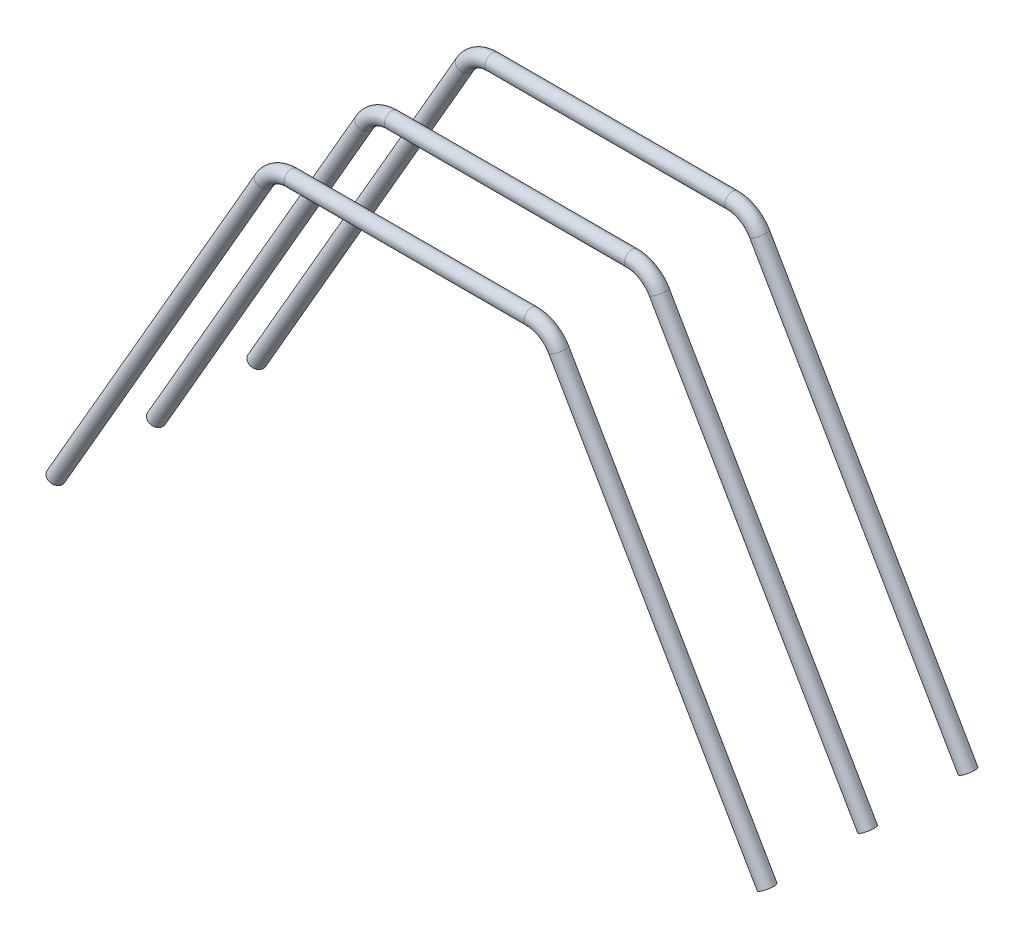
ISO-10303-21;
HEADER;
FILE_DESCRIPTION(('STEP AP214'),'2;1');
FILE_NAME('part.step','',(''),(''),'','','');
FILE_SCHEMA(('AUTOMOTIVE_DESIGN { 1 0 10303 214 1 1 1 1 }'));
ENDSEC;
DATA;
#1=APPLICATION_CONTEXT('core data for automotive mechanical design processes');
#2=APPLICATION_PROTOCOL_DEFINITION('international standard','automotive_design',2000,#1);
#3=PRODUCT_CONTEXT('',#1,'mechanical');
#4=PRODUCT('Part','Part','',(#3));
#5=PRODUCT_RELATED_PRODUCT_CATEGORY('part','',(#4));
#6=PRODUCT_DEFINITION_FORMATION('','',#4);
#7=PRODUCT_DEFINITION_CONTEXT('part definition',#1,'design');
#8=PRODUCT_DEFINITION('design','',#6,#7);
#9=PRODUCT_DEFINITION_SHAPE('','',#8);
#10=(LENGTH_UNIT() NAMED_UNIT(*) SI_UNIT(.MILLI.,.METRE.));
#11=(NAMED_UNIT(*) PLANE_ANGLE_UNIT() SI_UNIT($,.RADIAN.));
#12=(NAMED_UNIT(*) SI_UNIT($,.STERADIAN.) SOLID_ANGLE_UNIT());
#13=UNCERTAINTY_MEASURE_WITH_UNIT(LENGTH_MEASURE(1.E-05),#10,'distance_accuracy_value','');
#14=(GEOMETRIC_REPRESENTATION_CONTEXT(3) GLOBAL_UNCERTAINTY_ASSIGNED_CONTEXT((#13)) GLOBAL_UNIT_ASSIGNED_CONTEXT((#10,
#11,#12)) REPRESENTATION_CONTEXT('',''));
#15=CARTESIAN_POINT('',(0.,0.,0.));
#16=DIRECTION('',(0.,0.,1.));
#17=DIRECTION('',(1.,0.,0.));
#18=AXIS2_PLACEMENT_3D('',#15,#16,#17);
#19=CARTESIAN_POINT('',(283.205080756887,-322.,80.));
#20=DIRECTION('',(0.499999999999998,-0.86602540378444,0.));
#21=DIRECTION('',(0.,0.,1.));
#22=AXIS2_PLACEMENT_3D('',#19,#20,#21);
#23=PLANE('',#22);
#24=CARTESIAN_POINT('',(283.205080756887,-322.,80.));
#25=DIRECTION('',(-0.499999999999998,0.86602540378444,0.));
#26=DIRECTION('',(0.,0.,1.));
#27=AXIS2_PLACEMENT_3D('',#24,#25,#26);
#28=CIRCLE('',#27,6.);
#29=CARTESIAN_POINT('',(283.205080756887,-322.,86.));
#30=VERTEX_POINT('',#29);
#31=EDGE_CURVE('E11',#30,#30,#28,.T.);
#32=ORIENTED_EDGE('',*,*,#31,.F.);
#33=EDGE_LOOP('',(#32));
#34=FACE_BOUND('',#33,.T.);
#35=ADVANCED_FACE('F45',(#34),#23,.T.);
#36=CARTESIAN_POINT('',(0.,-22.,80.));
#37=DIRECTION('',(1.,0.,0.));
#38=DIRECTION('',(0.,1.,0.));
#39=AXIS2_PLACEMENT_3D('',#36,#37,#38);
#40=CYLINDRICAL_SURFACE('',#39,6.);
#41=CARTESIAN_POINT('',(95.5662432702594,-22.,80.));
#42=DIRECTION('',(-1.,0.,0.));
#43=DIRECTION('',(0.,0.,1.));
#44=AXIS2_PLACEMENT_3D('',#41,#42,#43);
#45=CIRCLE('',#44,6.);
#46=CARTESIAN_POINT('',(95.5662432702594,-16.,80.));
#47=VERTEX_POINT('',#46);
#48=EDGE_CURVE('E58',#47,#47,#45,.T.);
#49=ORIENTED_EDGE('',*,*,#48,.T.);
#50=EDGE_LOOP('',(#49));
#51=FACE_BOUND('',#50,.T.);
#52=CARTESIAN_POINT('',(-95.5662432702594,-22.,80.));
#53=DIRECTION('',(-1.,0.,0.));
#54=DIRECTION('',(0.,0.,1.));
#55=AXIS2_PLACEMENT_3D('',#52,#53,#54);
#56=CIRCLE('',#55,6.);
#57=CARTESIAN_POINT('',(-95.5662432702594,-16.,80.));
#58=VERTEX_POINT('',#57);
#59=EDGE_CURVE('E74',#58,#58,#56,.F.);
#60=ORIENTED_EDGE('',*,*,#59,.T.);
#61=EDGE_LOOP('',(#60));
#62=FACE_BOUND('',#61,.T.);
#63=ADVANCED_FACE('F80',(#51,#62),#40,.T.);
#64=CARTESIAN_POINT('',(95.5662432702594,-47.,80.));
#65=DIRECTION('',(0.,0.,1.));
#66=DIRECTION('',(-1.,0.,0.));
#67=AXIS2_PLACEMENT_3D('',#64,#65,#66);
#68=TOROIDAL_SURFACE('',#67,25.,6.);
#69=CARTESIAN_POINT('',(117.21687836487,-34.5,80.));
#70=DIRECTION('',(-0.499999999999998,0.86602540378444,0.));
#71=DIRECTION('',(0.,0.,1.));
#72=AXIS2_PLACEMENT_3D('',#69,#70,#71);
#73=CIRCLE('',#72,6.);
#74=CARTESIAN_POINT('',(122.413030787577,-31.5000000000001,80.));
#75=VERTEX_POINT('',#74);
#76=EDGE_CURVE('E52',#75,#75,#73,.T.);
#77=CARTESIAN_POINT('',(95.5662432702594,-47.,80.));
#78=DIRECTION('',(0.,0.,1.));
#79=DIRECTION('',(-1.,0.,0.));
#80=AXIS2_PLACEMENT_3D('',#77,#78,#79);
#81=CIRCLE('',#80,31.);
#82=EDGE_CURVE('',#75,#47,#81,.T.);
#83=ORIENTED_EDGE('',*,*,#76,.T.);
#84=ORIENTED_EDGE('',*,*,#48,.F.);
#85=ORIENTED_EDGE('',*,*,#82,.T.);
#86=ORIENTED_EDGE('',*,*,#82,.F.);
#87=EDGE_LOOP('',(#83,#85,#84,#86));
#88=FACE_BOUND('',#87,.T.);
#89=ADVANCED_FACE('F102',(#88),#68,.T.);
#90=CARTESIAN_POINT('',(117.21687836487,-34.5,80.));
#91=DIRECTION('',(0.499999999999998,-0.86602540378444,0.));
#92=DIRECTION('',(0.86602540378444,0.499999999999998,0.));
#93=AXIS2_PLACEMENT_3D('',#90,#91,#92);
#94=CYLINDRICAL_SURFACE('',#93,6.);
#95=ORIENTED_EDGE('',*,*,#31,.T.);
#96=EDGE_LOOP('',(#95));
#97=FACE_BOUND('',#96,.T.);
#98=ORIENTED_EDGE('',*,*,#76,.F.);
#99=EDGE_LOOP('',(#98));
#100=FACE_BOUND('',#99,.T.);
#101=ADVANCED_FACE('F94',(#97,#100),#94,.T.);
#102=CARTESIAN_POINT('',(-283.205080756887,-322.,80.));
#103=DIRECTION('',(-0.499999999999998,-0.86602540378444,0.));
#104=DIRECTION('',(0.,0.,1.));
#105=AXIS2_PLACEMENT_3D('',#102,#103,#104);
#106=PLANE('',#105);
#107=CARTESIAN_POINT('',(-283.205080756887,-322.,80.));
#108=DIRECTION('',(-0.499999999999998,-0.86602540378444,0.));
#109=DIRECTION('',(0.,0.,1.));
#110=AXIS2_PLACEMENT_3D('',#107,#108,#109);
#111=CIRCLE('',#110,6.);
#112=CARTESIAN_POINT('',(-283.205080756887,-322.,86.));
#113=VERTEX_POINT('',#112);
#114=EDGE_CURVE('E64',#113,#113,#111,.F.);
#115=ORIENTED_EDGE('',*,*,#114,.F.);
#116=EDGE_LOOP('',(#115));
#117=FACE_BOUND('',#116,.T.);
#118=ADVANCED_FACE('F85',(#117),#106,.T.);
#119=CARTESIAN_POINT('',(-95.5662432702594,-47.,80.));
#120=DIRECTION('',(0.,0.,-1.));
#121=DIRECTION('',(1.,0.,0.));
#122=AXIS2_PLACEMENT_3D('',#119,#120,#121);
#123=TOROIDAL_SURFACE('',#122,25.,6.);
#124=CARTESIAN_POINT('',(-117.21687836487,-34.5,80.));
#125=DIRECTION('',(-0.499999999999998,-0.86602540378444,0.));
#126=DIRECTION('',(0.,0.,1.));
#127=AXIS2_PLACEMENT_3D('',#124,#125,#126);
#128=CIRCLE('',#127,6.);
#129=CARTESIAN_POINT('',(-122.413030787577,-31.5000000000001,80.));
#130=VERTEX_POINT('',#129);
#131=EDGE_CURVE('E70',#130,#130,#128,.F.);
#132=CARTESIAN_POINT('',(-95.5662432702594,-47.,80.));
#133=DIRECTION('',(0.,0.,-1.));
#134=DIRECTION('',(1.,0.,0.));
#135=AXIS2_PLACEMENT_3D('',#132,#133,#134);
#136=CIRCLE('',#135,31.);
#137=EDGE_CURVE('',#130,#58,#136,.T.);
#138=ORIENTED_EDGE('',*,*,#131,.T.);
#139=ORIENTED_EDGE('',*,*,#59,.F.);
#140=ORIENTED_EDGE('',*,*,#137,.T.);
#141=ORIENTED_EDGE('',*,*,#137,.F.);
#142=EDGE_LOOP('',(#138,#140,#139,#141));
#143=FACE_BOUND('',#142,.T.);
#144=ADVANCED_FACE('F82',(#143),#123,.T.);
#145=CARTESIAN_POINT('',(-117.21687836487,-34.5,80.));
#146=DIRECTION('',(-0.499999999999998,-0.86602540378444,0.));
#147=DIRECTION('',(0.86602540378444,-0.499999999999998,0.));
#148=AXIS2_PLACEMENT_3D('',#145,#146,#147);
#149=CYLINDRICAL_SURFACE('',#148,6.);
#150=ORIENTED_EDGE('',*,*,#114,.T.);
#151=EDGE_LOOP('',(#150));
#152=FACE_BOUND('',#151,.T.);
#153=ORIENTED_EDGE('',*,*,#131,.F.);
#154=EDGE_LOOP('',(#153));
#155=FACE_BOUND('',#154,.T.);
#156=ADVANCED_FACE('F84',(#152,#155),#149,.T.);
#157=CLOSED_SHELL('',(#35,#63,#89,#101,#118,#144,#156));
#158=MANIFOLD_SOLID_BREP('B2',#157);
#159=CARTESIAN_POINT('',(283.205080756887,-322.,-80.));
#160=DIRECTION('',(0.499999999999998,-0.86602540378444,0.));
#161=DIRECTION('',(0.,0.,-1.));
#162=AXIS2_PLACEMENT_3D('',#159,#160,#161);
#163=PLANE('',#162);
#164=CARTESIAN_POINT('',(283.205080756887,-322.,-80.));
#165=DIRECTION('',(0.499999999999998,-0.86602540378444,0.));
#166=DIRECTION('',(0.,0.,-1.));
#167=AXIS2_PLACEMENT_3D('',#164,#165,#166);
#168=CIRCLE('',#167,6.);
#169=CARTESIAN_POINT('',(283.205080756887,-322.,-86.));
#170=VERTEX_POINT('',#169);
#171=EDGE_CURVE('E44',#170,#170,#168,.T.);
#172=ORIENTED_EDGE('',*,*,#171,.T.);
#173=EDGE_LOOP('',(#172));
#174=FACE_BOUND('',#173,.T.);
#175=ADVANCED_FACE('F181',(#174),#163,.T.);
#176=CARTESIAN_POINT('',(0.,-22.,-80.));
#177=DIRECTION('',(1.,0.,0.));
#178=DIRECTION('',(0.,1.,0.));
#179=AXIS2_PLACEMENT_3D('',#176,#177,#178);
#180=CYLINDRICAL_SURFACE('',#179,6.);
#181=CARTESIAN_POINT('',(95.5662432702594,-22.,-80.));
#182=DIRECTION('',(1.,0.,0.));
#183=DIRECTION('',(0.,0.,-1.));
#184=AXIS2_PLACEMENT_3D('',#181,#182,#183);
#185=CIRCLE('',#184,6.);
#186=CARTESIAN_POINT('',(95.5662432702594,-16.,-80.));
#187=VERTEX_POINT('',#186);
#188=EDGE_CURVE('E194',#187,#187,#185,.T.);
#189=ORIENTED_EDGE('',*,*,#188,.F.);
#190=EDGE_LOOP('',(#189));
#191=FACE_BOUND('',#190,.T.);
#192=CARTESIAN_POINT('',(-95.5662432702594,-22.,-80.));
#193=DIRECTION('',(1.,0.,0.));
#194=DIRECTION('',(0.,0.,-1.));
#195=AXIS2_PLACEMENT_3D('',#192,#193,#194);
#196=CIRCLE('',#195,6.);
#197=CARTESIAN_POINT('',(-95.5662432702594,-16.,-80.));
#198=VERTEX_POINT('',#197);
#199=EDGE_CURVE('E210',#198,#198,#196,.F.);
#200=ORIENTED_EDGE('',*,*,#199,.F.);
#201=EDGE_LOOP('',(#200));
#202=FACE_BOUND('',#201,.T.);
#203=ADVANCED_FACE('F218',(#191,#202),#180,.T.);
#204=CARTESIAN_POINT('',(95.5662432702594,-47.,-80.));
#205=DIRECTION('',(0.,0.,-1.));
#206=DIRECTION('',(-1.,0.,0.));
#207=AXIS2_PLACEMENT_3D('',#204,#205,#206);
#208=TOROIDAL_SURFACE('',#207,25.,6.);
#209=CARTESIAN_POINT('',(117.21687836487,-34.5,-80.));
#210=DIRECTION('',(0.499999999999998,-0.86602540378444,0.));
#211=DIRECTION('',(0.,0.,-1.));
#212=AXIS2_PLACEMENT_3D('',#209,#210,#211);
#213=CIRCLE('',#212,6.);
#214=CARTESIAN_POINT('',(122.413030787577,-31.5000000000001,-80.));
#215=VERTEX_POINT('',#214);
#216=EDGE_CURVE('E188',#215,#215,#213,.T.);
#217=CARTESIAN_POINT('',(95.5662432702594,-47.,-80.));
#218=DIRECTION('',(0.,0.,-1.));
#219=DIRECTION('',(-1.,0.,0.));
#220=AXIS2_PLACEMENT_3D('',#217,#218,#219);
#221=CIRCLE('',#220,31.);
#222=EDGE_CURVE('',#187,#215,#221,.T.);
#223=ORIENTED_EDGE('',*,*,#188,.T.);
#224=ORIENTED_EDGE('',*,*,#216,.F.);
#225=ORIENTED_EDGE('',*,*,#222,.T.);
#226=ORIENTED_EDGE('',*,*,#222,.F.);
#227=EDGE_LOOP('',(#223,#225,#224,#226));
#228=FACE_BOUND('',#227,.T.);
#229=ADVANCED_FACE('F220',(#228),#208,.T.);
#230=CARTESIAN_POINT('',(117.21687836487,-34.5,-80.));
#231=DIRECTION('',(0.499999999999998,-0.86602540378444,0.));
#232=DIRECTION('',(0.86602540378444,0.499999999999998,0.));
#233=AXIS2_PLACEMENT_3D('',#230,#231,#232);
#234=CYLINDRICAL_SURFACE('',#233,6.);
#235=ORIENTED_EDGE('',*,*,#171,.F.);
#236=EDGE_LOOP('',(#235));
#237=FACE_BOUND('',#236,.T.);
#238=ORIENTED_EDGE('',*,*,#216,.T.);
#239=EDGE_LOOP('',(#238));
#240=FACE_BOUND('',#239,.T.);
#241=ADVANCED_FACE('F227',(#237,#240),#234,.T.);
#242=CARTESIAN_POINT('',(-283.205080756887,-322.,-80.));
#243=DIRECTION('',(-0.499999999999998,-0.86602540378444,0.));
#244=DIRECTION('',(0.,0.,-1.));
#245=AXIS2_PLACEMENT_3D('',#242,#243,#244);
#246=PLANE('',#245);
#247=CARTESIAN_POINT('',(-283.205080756887,-322.,-80.));
#248=DIRECTION('',(0.499999999999998,0.86602540378444,0.));
#249=DIRECTION('',(0.,0.,-1.));
#250=AXIS2_PLACEMENT_3D('',#247,#248,#249);
#251=CIRCLE('',#250,6.);
#252=CARTESIAN_POINT('',(-283.205080756887,-322.,-86.));
#253=VERTEX_POINT('',#252);
#254=EDGE_CURVE('E200',#253,#253,#251,.F.);
#255=ORIENTED_EDGE('',*,*,#254,.T.);
#256=EDGE_LOOP('',(#255));
#257=FACE_BOUND('',#256,.T.);
#258=ADVANCED_FACE('F234',(#257),#246,.T.);
#259=CARTESIAN_POINT('',(-95.5662432702594,-47.,-80.));
#260=DIRECTION('',(0.,0.,1.));
#261=DIRECTION('',(1.,0.,0.));
#262=AXIS2_PLACEMENT_3D('',#259,#260,#261);
#263=TOROIDAL_SURFACE('',#262,25.,6.);
#264=CARTESIAN_POINT('',(-117.21687836487,-34.5,-80.));
#265=DIRECTION('',(0.499999999999998,0.86602540378444,0.));
#266=DIRECTION('',(0.,0.,-1.));
#267=AXIS2_PLACEMENT_3D('',#264,#265,#266);
#268=CIRCLE('',#267,6.);
#269=CARTESIAN_POINT('',(-122.413030787577,-31.5000000000001,-80.));
#270=VERTEX_POINT('',#269);
#271=EDGE_CURVE('E206',#270,#270,#268,.F.);
#272=CARTESIAN_POINT('',(-95.5662432702594,-47.,-80.));
#273=DIRECTION('',(0.,0.,1.));
#274=DIRECTION('',(1.,0.,0.));
#275=AXIS2_PLACEMENT_3D('',#272,#273,#274);
#276=CIRCLE('',#275,31.);
#277=EDGE_CURVE('',#198,#270,#276,.T.);
#278=ORIENTED_EDGE('',*,*,#199,.T.);
#279=ORIENTED_EDGE('',*,*,#271,.F.);
#280=ORIENTED_EDGE('',*,*,#277,.T.);
#281=ORIENTED_EDGE('',*,*,#277,.F.);
#282=EDGE_LOOP('',(#278,#280,#279,#281));
#283=FACE_BOUND('',#282,.T.);
#284=ADVANCED_FACE('F216',(#283),#263,.T.);
#285=CARTESIAN_POINT('',(-117.21687836487,-34.5,-80.));
#286=DIRECTION('',(-0.499999999999998,-0.86602540378444,0.));
#287=DIRECTION('',(0.86602540378444,-0.499999999999998,0.));
#288=AXIS2_PLACEMENT_3D('',#285,#286,#287);
#289=CYLINDRICAL_SURFACE('',#288,6.);
#290=ORIENTED_EDGE('',*,*,#254,.F.);
#291=EDGE_LOOP('',(#290));
#292=FACE_BOUND('',#291,.T.);
#293=ORIENTED_EDGE('',*,*,#271,.T.);
#294=EDGE_LOOP('',(#293));
#295=FACE_BOUND('',#294,.T.);
#296=ADVANCED_FACE('F230',(#292,#295),#289,.T.);
#297=CLOSED_SHELL('',(#175,#203,#229,#241,#258,#284,#296));
#298=MANIFOLD_SOLID_BREP('B6',#297);
#299=CARTESIAN_POINT('',(283.205080756887,-322.,0.));
#300=DIRECTION('',(0.499999999999998,-0.86602540378444,0.));
#301=DIRECTION('',(0.,0.,-1.));
#302=AXIS2_PLACEMENT_3D('',#299,#300,#301);
#303=PLANE('',#302);
#304=CARTESIAN_POINT('',(283.205080756887,-322.,0.));
#305=DIRECTION('',(0.499999999999998,-0.86602540378444,0.));
#306=DIRECTION('',(0.,0.,-1.));
#307=AXIS2_PLACEMENT_3D('',#304,#305,#306);
#308=CIRCLE('',#307,6.);
#309=CARTESIAN_POINT('',(283.205080756887,-322.,-6.));
#310=VERTEX_POINT('',#309);
#311=EDGE_CURVE('E180',#310,#310,#308,.T.);
#312=ORIENTED_EDGE('',*,*,#311,.T.);
#313=EDGE_LOOP('',(#312));
#314=FACE_BOUND('',#313,.T.);
#315=ADVANCED_FACE('F310',(#314),#303,.T.);
#316=CARTESIAN_POINT('',(0.,-22.,0.));
#317=DIRECTION('',(1.,0.,0.));
#318=DIRECTION('',(0.,1.,0.));
#319=AXIS2_PLACEMENT_3D('',#316,#317,#318);
#320=CYLINDRICAL_SURFACE('',#319,6.);
#321=CARTESIAN_POINT('',(95.5662432702594,-22.,0.));
#322=DIRECTION('',(1.,0.,0.));
#323=DIRECTION('',(0.,0.,-1.));
#324=AXIS2_PLACEMENT_3D('',#321,#322,#323);
#325=CIRCLE('',#324,6.);
#326=CARTESIAN_POINT('',(95.5662432702594,-16.,0.));
#327=VERTEX_POINT('',#326);
#328=EDGE_CURVE('E323',#327,#327,#325,.T.);
#329=ORIENTED_EDGE('',*,*,#328,.F.);
#330=EDGE_LOOP('',(#329));
#331=FACE_BOUND('',#330,.T.);
#332=CARTESIAN_POINT('',(-95.5662432702594,-22.,0.));
#333=DIRECTION('',(1.,0.,0.));
#334=DIRECTION('',(0.,0.,-1.));
#335=AXIS2_PLACEMENT_3D('',#332,#333,#334);
#336=CIRCLE('',#335,6.);
#337=CARTESIAN_POINT('',(-95.5662432702594,-16.,0.));
#338=VERTEX_POINT('',#337);
#339=EDGE_CURVE('E339',#338,#338,#336,.F.);
#340=ORIENTED_EDGE('',*,*,#339,.F.);
#341=EDGE_LOOP('',(#340));
#342=FACE_BOUND('',#341,.T.);
#343=ADVANCED_FACE('F347',(#331,#342),#320,.T.);
#344=CARTESIAN_POINT('',(95.5662432702594,-47.,0.));
#345=DIRECTION('',(0.,0.,-1.));
#346=DIRECTION('',(-1.,0.,0.));
#347=AXIS2_PLACEMENT_3D('',#344,#345,#346);
#348=TOROIDAL_SURFACE('',#347,25.,6.);
#349=CARTESIAN_POINT('',(117.21687836487,-34.5,0.));
#350=DIRECTION('',(0.499999999999998,-0.86602540378444,0.));
#351=DIRECTION('',(0.,0.,-1.));
#352=AXIS2_PLACEMENT_3D('',#349,#350,#351);
#353=CIRCLE('',#352,6.);
#354=CARTESIAN_POINT('',(122.413030787577,-31.5000000000001,0.));
#355=VERTEX_POINT('',#354);
#356=EDGE_CURVE('E317',#355,#355,#353,.T.);
#357=CARTESIAN_POINT('',(95.5662432702594,-47.,0.));
#358=DIRECTION('',(0.,0.,-1.));
#359=DIRECTION('',(-1.,0.,0.));
#360=AXIS2_PLACEMENT_3D('',#357,#358,#359);
#361=CIRCLE('',#360,31.);
#362=EDGE_CURVE('',#327,#355,#361,.T.);
#363=ORIENTED_EDGE('',*,*,#328,.T.);
#364=ORIENTED_EDGE('',*,*,#356,.F.);
#365=ORIENTED_EDGE('',*,*,#362,.T.);
#366=ORIENTED_EDGE('',*,*,#362,.F.);
#367=EDGE_LOOP('',(#363,#365,#364,#366));
#368=FACE_BOUND('',#367,.T.);
#369=ADVANCED_FACE('F349',(#368),#348,.T.);
#370=CARTESIAN_POINT('',(117.21687836487,-34.5,0.));
#371=DIRECTION('',(0.499999999999998,-0.86602540378444,0.));
#372=DIRECTION('',(0.86602540378444,0.499999999999998,0.));
#373=AXIS2_PLACEMENT_3D('',#370,#371,#372);
#374=CYLINDRICAL_SURFACE('',#373,6.);
#375=ORIENTED_EDGE('',*,*,#311,.F.);
#376=EDGE_LOOP('',(#375));
#377=FACE_BOUND('',#376,.T.);
#378=ORIENTED_EDGE('',*,*,#356,.T.);
#379=EDGE_LOOP('',(#378));
#380=FACE_BOUND('',#379,.T.);
#381=ADVANCED_FACE('F356',(#377,#380),#374,.T.);
#382=CARTESIAN_POINT('',(-283.205080756887,-322.,0.));
#383=DIRECTION('',(-0.499999999999998,-0.86602540378444,0.));
#384=DIRECTION('',(0.,0.,-1.));
#385=AXIS2_PLACEMENT_3D('',#382,#383,#384);
#386=PLANE('',#385);
#387=CARTESIAN_POINT('',(-283.205080756887,-322.,0.));
#388=DIRECTION('',(0.499999999999998,0.86602540378444,0.));
#389=DIRECTION('',(0.,0.,-1.));
#390=AXIS2_PLACEMENT_3D('',#387,#388,#389);
#391=CIRCLE('',#390,6.);
#392=CARTESIAN_POINT('',(-283.205080756887,-322.,-6.));
#393=VERTEX_POINT('',#392);
#394=EDGE_CURVE('E329',#393,#393,#391,.F.);
#395=ORIENTED_EDGE('',*,*,#394,.T.);
#396=EDGE_LOOP('',(#395));
#397=FACE_BOUND('',#396,.T.);
#398=ADVANCED_FACE('F363',(#397),#386,.T.);
#399=CARTESIAN_POINT('',(-95.5662432702594,-47.,0.));
#400=DIRECTION('',(0.,0.,1.));
#401=DIRECTION('',(1.,0.,0.));
#402=AXIS2_PLACEMENT_3D('',#399,#400,#401);
#403=TOROIDAL_SURFACE('',#402,25.,6.);
#404=CARTESIAN_POINT('',(-117.21687836487,-34.5,0.));
#405=DIRECTION('',(0.499999999999998,0.86602540378444,0.));
#406=DIRECTION('',(0.,0.,-1.));
#407=AXIS2_PLACEMENT_3D('',#404,#405,#406);
#408=CIRCLE('',#407,6.);
#409=CARTESIAN_POINT('',(-122.413030787577,-31.5000000000001,0.));
#410=VERTEX_POINT('',#409);
#411=EDGE_CURVE('E335',#410,#410,#408,.F.);
#412=CARTESIAN_POINT('',(-95.5662432702594,-47.,0.));
#413=DIRECTION('',(0.,0.,1.));
#414=DIRECTION('',(1.,0.,0.));
#415=AXIS2_PLACEMENT_3D('',#412,#413,#414);
#416=CIRCLE('',#415,31.);
#417=EDGE_CURVE('',#338,#410,#416,.T.);
#418=ORIENTED_EDGE('',*,*,#339,.T.);
#419=ORIENTED_EDGE('',*,*,#411,.F.);
#420=ORIENTED_EDGE('',*,*,#417,.T.);
#421=ORIENTED_EDGE('',*,*,#417,.F.);
#422=EDGE_LOOP('',(#418,#420,#419,#421));
#423=FACE_BOUND('',#422,.T.);
#424=ADVANCED_FACE('F345',(#423),#403,.T.);
#425=CARTESIAN_POINT('',(-117.21687836487,-34.5,0.));
#426=DIRECTION('',(-0.499999999999998,-0.86602540378444,0.));
#427=DIRECTION('',(0.86602540378444,-0.499999999999998,0.));
#428=AXIS2_PLACEMENT_3D('',#425,#426,#427);
#429=CYLINDRICAL_SURFACE('',#428,6.);
#430=ORIENTED_EDGE('',*,*,#394,.F.);
#431=EDGE_LOOP('',(#430));
#432=FACE_BOUND('',#431,.T.);
#433=ORIENTED_EDGE('',*,*,#411,.T.);
#434=EDGE_LOOP('',(#433));
#435=FACE_BOUND('',#434,.T.);
#436=ADVANCED_FACE('F359',(#432,#435),#429,.T.);
#437=CLOSED_SHELL('',(#315,#343,#369,#381,#398,#424,#436));
#438=MANIFOLD_SOLID_BREP('B39',#437);
#439=ADVANCED_BREP_SHAPE_REPRESENTATION('',(#18,#158,#298,#438),#14);
#440=SHAPE_DEFINITION_REPRESENTATION(#9,#439);
ENDSEC;
END-ISO-10303-21;
